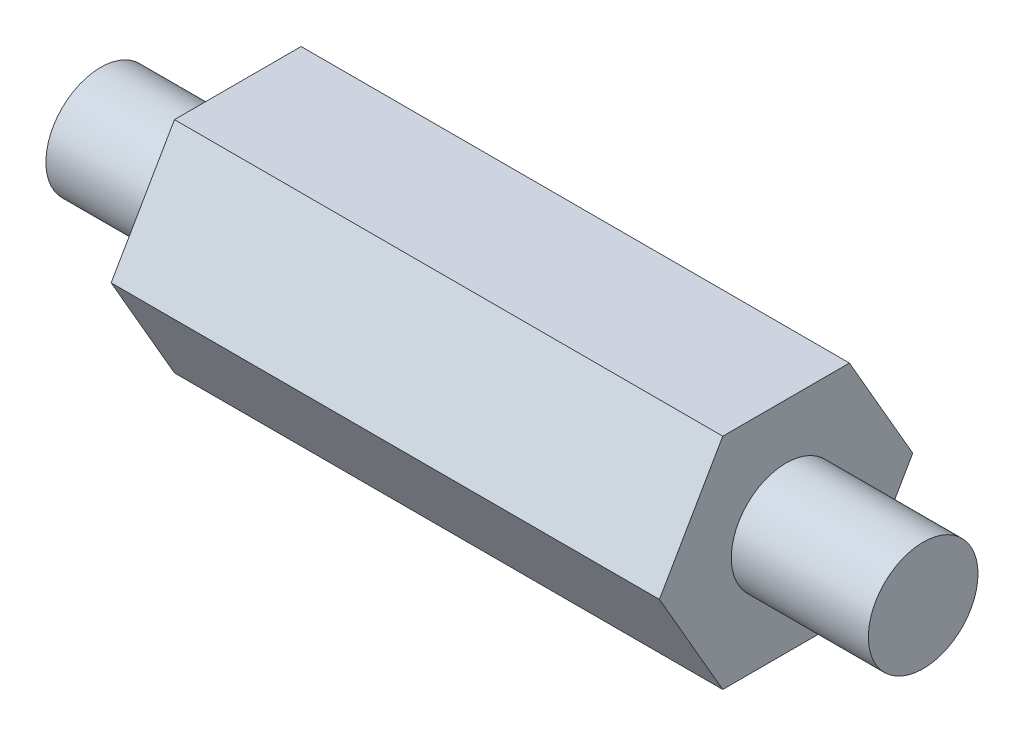
ISO-10303-21;
HEADER;
FILE_DESCRIPTION(('STEP AP214'),'2;1');
FILE_NAME('part.step','',(''),(''),'','','');
FILE_SCHEMA(('AUTOMOTIVE_DESIGN { 1 0 10303 214 1 1 1 1 }'));
ENDSEC;
DATA;
#1=APPLICATION_CONTEXT('core data for automotive mechanical design processes');
#2=APPLICATION_PROTOCOL_DEFINITION('international standard','automotive_design',2000,#1);
#3=PRODUCT_CONTEXT('',#1,'mechanical');
#4=PRODUCT('Part','Part','',(#3));
#5=PRODUCT_RELATED_PRODUCT_CATEGORY('part','',(#4));
#6=PRODUCT_DEFINITION_FORMATION('','',#4);
#7=PRODUCT_DEFINITION_CONTEXT('part definition',#1,'design');
#8=PRODUCT_DEFINITION('design','',#6,#7);
#9=PRODUCT_DEFINITION_SHAPE('','',#8);
#10=(LENGTH_UNIT() NAMED_UNIT(*) SI_UNIT(.MILLI.,.METRE.));
#11=(NAMED_UNIT(*) PLANE_ANGLE_UNIT() SI_UNIT($,.RADIAN.));
#12=(NAMED_UNIT(*) SI_UNIT($,.STERADIAN.) SOLID_ANGLE_UNIT());
#13=UNCERTAINTY_MEASURE_WITH_UNIT(LENGTH_MEASURE(1.E-05),#10,'distance_accuracy_value','');
#14=(GEOMETRIC_REPRESENTATION_CONTEXT(3) GLOBAL_UNCERTAINTY_ASSIGNED_CONTEXT((#13)) GLOBAL_UNIT_ASSIGNED_CONTEXT((#10,
#11,#12)) REPRESENTATION_CONTEXT('',''));
#15=CARTESIAN_POINT('',(0.,0.,0.));
#16=DIRECTION('',(0.,0.,1.));
#17=DIRECTION('',(1.,0.,0.));
#18=AXIS2_PLACEMENT_3D('',#15,#16,#17);
#19=CARTESIAN_POINT('',(15.,0.,0.));
#20=DIRECTION('',(-1.,0.,0.));
#21=DIRECTION('',(0.,0.,1.));
#22=AXIS2_PLACEMENT_3D('',#19,#20,#21);
#23=CYLINDRICAL_SURFACE('',#22,2.);
#24=CARTESIAN_POINT('',(10.,0.,0.));
#25=DIRECTION('',(1.,0.,0.));
#26=DIRECTION('',(0.,0.,-1.));
#27=AXIS2_PLACEMENT_3D('',#24,#25,#26);
#28=CIRCLE('',#27,2.);
#29=CARTESIAN_POINT('',(10.,0.,-2.));
#30=VERTEX_POINT('',#29);
#31=EDGE_CURVE('E115',#30,#30,#28,.T.);
#32=ORIENTED_EDGE('',*,*,#31,.T.);
#33=EDGE_LOOP('',(#32));
#34=FACE_BOUND('',#33,.T.);
#35=CARTESIAN_POINT('',(15.,0.,0.));
#36=DIRECTION('',(1.,0.,0.));
#37=DIRECTION('',(0.,0.,-1.));
#38=AXIS2_PLACEMENT_3D('',#35,#36,#37);
#39=CIRCLE('',#38,2.);
#40=CARTESIAN_POINT('',(15.,0.,-2.));
#41=VERTEX_POINT('',#40);
#42=EDGE_CURVE('E42',#41,#41,#39,.T.);
#43=ORIENTED_EDGE('',*,*,#42,.F.);
#44=EDGE_LOOP('',(#43));
#45=FACE_BOUND('',#44,.T.);
#46=ADVANCED_FACE('F34',(#34,#45),#23,.T.);
#47=CARTESIAN_POINT('',(15.,0.,0.));
#48=DIRECTION('',(1.,0.,0.));
#49=DIRECTION('',(0.,0.,-1.));
#50=AXIS2_PLACEMENT_3D('',#47,#48,#49);
#51=PLANE('',#50);
#52=ORIENTED_EDGE('',*,*,#42,.T.);
#53=EDGE_LOOP('',(#52));
#54=FACE_BOUND('',#53,.T.);
#55=ADVANCED_FACE('F161',(#54),#51,.T.);
#56=CARTESIAN_POINT('',(10.,2.00051868274205,3.465));
#57=DIRECTION('',(0.,0.5,0.866025403784439));
#58=DIRECTION('',(0.,-0.866025403784439,0.5));
#59=AXIS2_PLACEMENT_3D('',#56,#57,#58);
#60=PLANE('',#59);
#61=DIRECTION('',(0.,0.866025403784439,-0.5));
#62=VECTOR('',#61,1.);
#63=CARTESIAN_POINT('',(-10.,2.00051868274205,3.465));
#64=LINE('',#63,#62);
#65=CARTESIAN_POINT('',(-10.,0.,4.62));
#66=VERTEX_POINT('',#65);
#67=CARTESIAN_POINT('',(-10.,4.00103736548411,2.31));
#68=VERTEX_POINT('',#67);
#69=EDGE_CURVE('E121',#66,#68,#64,.T.);
#70=ORIENTED_EDGE('',*,*,#69,.F.);
#71=DIRECTION('',(-1.,0.,0.));
#72=VECTOR('',#71,1.);
#73=CARTESIAN_POINT('',(10.,0.,4.62));
#74=LINE('',#73,#72);
#75=CARTESIAN_POINT('',(10.,0.,4.62));
#76=VERTEX_POINT('',#75);
#77=EDGE_CURVE('E79',#76,#66,#74,.T.);
#78=ORIENTED_EDGE('',*,*,#77,.F.);
#79=DIRECTION('',(0.,0.866025403784439,-0.5));
#80=VECTOR('',#79,1.);
#81=CARTESIAN_POINT('',(10.,2.00051868274205,3.465));
#82=LINE('',#81,#80);
#83=CARTESIAN_POINT('',(10.,4.00103736548411,2.31));
#84=VERTEX_POINT('',#83);
#85=EDGE_CURVE('E135',#76,#84,#82,.T.);
#86=ORIENTED_EDGE('',*,*,#85,.T.);
#87=DIRECTION('',(-1.,0.,0.));
#88=VECTOR('',#87,1.);
#89=CARTESIAN_POINT('',(10.,4.00103736548411,2.31));
#90=LINE('',#89,#88);
#91=EDGE_CURVE('E50',#84,#68,#90,.T.);
#92=ORIENTED_EDGE('',*,*,#91,.T.);
#93=EDGE_LOOP('',(#70,#78,#86,#92));
#94=FACE_BOUND('',#93,.T.);
#95=ADVANCED_FACE('F166',(#94),#60,.T.);
#96=CARTESIAN_POINT('',(10.,-2.00051868274205,3.465));
#97=DIRECTION('',(0.,-0.5,0.866025403784439));
#98=DIRECTION('',(0.,-0.866025403784439,-0.5));
#99=AXIS2_PLACEMENT_3D('',#96,#97,#98);
#100=PLANE('',#99);
#101=DIRECTION('',(0.,0.866025403784439,0.5));
#102=VECTOR('',#101,1.);
#103=CARTESIAN_POINT('',(-10.,-2.00051868274205,3.465));
#104=LINE('',#103,#102);
#105=CARTESIAN_POINT('',(-10.,-4.00103736548411,2.31));
#106=VERTEX_POINT('',#105);
#107=EDGE_CURVE('E123',#106,#66,#104,.T.);
#108=ORIENTED_EDGE('',*,*,#107,.F.);
#109=DIRECTION('',(-1.,0.,0.));
#110=VECTOR('',#109,1.);
#111=CARTESIAN_POINT('',(10.,-4.00103736548411,2.31));
#112=LINE('',#111,#110);
#113=CARTESIAN_POINT('',(10.,-4.00103736548411,2.31));
#114=VERTEX_POINT('',#113);
#115=EDGE_CURVE('E139',#114,#106,#112,.T.);
#116=ORIENTED_EDGE('',*,*,#115,.F.);
#117=DIRECTION('',(0.,0.866025403784439,0.5));
#118=VECTOR('',#117,1.);
#119=CARTESIAN_POINT('',(10.,-2.00051868274205,3.465));
#120=LINE('',#119,#118);
#121=EDGE_CURVE('E198',#114,#76,#120,.T.);
#122=ORIENTED_EDGE('',*,*,#121,.T.);
#123=ORIENTED_EDGE('',*,*,#77,.T.);
#124=EDGE_LOOP('',(#108,#116,#122,#123));
#125=FACE_BOUND('',#124,.T.);
#126=ADVANCED_FACE('F186',(#125),#100,.T.);
#127=CARTESIAN_POINT('',(10.,-4.00103736548411,0.));
#128=DIRECTION('',(0.,-1.,0.));
#129=DIRECTION('',(0.,0.,-1.));
#130=AXIS2_PLACEMENT_3D('',#127,#128,#129);
#131=PLANE('',#130);
#132=DIRECTION('',(0.,0.,1.));
#133=VECTOR('',#132,1.);
#134=CARTESIAN_POINT('',(-10.,-4.00103736548411,0.));
#135=LINE('',#134,#133);
#136=CARTESIAN_POINT('',(-10.,-4.00103736548411,-2.31));
#137=VERTEX_POINT('',#136);
#138=EDGE_CURVE('E126',#137,#106,#135,.T.);
#139=ORIENTED_EDGE('',*,*,#138,.F.);
#140=DIRECTION('',(-1.,0.,0.));
#141=VECTOR('',#140,1.);
#142=CARTESIAN_POINT('',(10.,-4.00103736548411,-2.31));
#143=LINE('',#142,#141);
#144=CARTESIAN_POINT('',(10.,-4.00103736548411,-2.31));
#145=VERTEX_POINT('',#144);
#146=EDGE_CURVE('E99',#145,#137,#143,.T.);
#147=ORIENTED_EDGE('',*,*,#146,.F.);
#148=DIRECTION('',(0.,0.,1.));
#149=VECTOR('',#148,1.);
#150=CARTESIAN_POINT('',(10.,-4.00103736548411,0.));
#151=LINE('',#150,#149);
#152=EDGE_CURVE('E110',#145,#114,#151,.T.);
#153=ORIENTED_EDGE('',*,*,#152,.T.);
#154=ORIENTED_EDGE('',*,*,#115,.T.);
#155=EDGE_LOOP('',(#139,#147,#153,#154));
#156=FACE_BOUND('',#155,.T.);
#157=ADVANCED_FACE('F183',(#156),#131,.T.);
#158=CARTESIAN_POINT('',(10.,-2.00051868274205,-3.465));
#159=DIRECTION('',(0.,-0.5,-0.866025403784439));
#160=DIRECTION('',(0.,0.866025403784439,-0.5));
#161=AXIS2_PLACEMENT_3D('',#158,#159,#160);
#162=PLANE('',#161);
#163=DIRECTION('',(0.,-0.866025403784439,0.5));
#164=VECTOR('',#163,1.);
#165=CARTESIAN_POINT('',(-10.,-2.00051868274205,-3.465));
#166=LINE('',#165,#164);
#167=CARTESIAN_POINT('',(-10.,0.,-4.62));
#168=VERTEX_POINT('',#167);
#169=EDGE_CURVE('E95',#168,#137,#166,.T.);
#170=ORIENTED_EDGE('',*,*,#169,.F.);
#171=DIRECTION('',(-1.,0.,0.));
#172=VECTOR('',#171,1.);
#173=CARTESIAN_POINT('',(10.,0.,-4.62));
#174=LINE('',#173,#172);
#175=CARTESIAN_POINT('',(10.,0.,-4.62));
#176=VERTEX_POINT('',#175);
#177=EDGE_CURVE('E90',#176,#168,#174,.T.);
#178=ORIENTED_EDGE('',*,*,#177,.F.);
#179=DIRECTION('',(0.,-0.866025403784439,0.5));
#180=VECTOR('',#179,1.);
#181=CARTESIAN_POINT('',(10.,-2.00051868274205,-3.465));
#182=LINE('',#181,#180);
#183=EDGE_CURVE('E93',#176,#145,#182,.T.);
#184=ORIENTED_EDGE('',*,*,#183,.T.);
#185=ORIENTED_EDGE('',*,*,#146,.T.);
#186=EDGE_LOOP('',(#170,#178,#184,#185));
#187=FACE_BOUND('',#186,.T.);
#188=ADVANCED_FACE('F92',(#187),#162,.T.);
#189=CARTESIAN_POINT('',(10.,2.00051868274205,-3.465));
#190=DIRECTION('',(0.,0.5,-0.866025403784439));
#191=DIRECTION('',(0.,0.866025403784439,0.5));
#192=AXIS2_PLACEMENT_3D('',#189,#190,#191);
#193=PLANE('',#192);
#194=DIRECTION('',(0.,-0.866025403784439,-0.5));
#195=VECTOR('',#194,1.);
#196=CARTESIAN_POINT('',(-10.,2.00051868274205,-3.465));
#197=LINE('',#196,#195);
#198=CARTESIAN_POINT('',(-10.,4.00103736548411,-2.31));
#199=VERTEX_POINT('',#198);
#200=EDGE_CURVE('E130',#199,#168,#197,.T.);
#201=ORIENTED_EDGE('',*,*,#200,.F.);
#202=DIRECTION('',(-1.,0.,0.));
#203=VECTOR('',#202,1.);
#204=CARTESIAN_POINT('',(10.,4.00103736548411,-2.31));
#205=LINE('',#204,#203);
#206=CARTESIAN_POINT('',(10.,4.00103736548411,-2.31));
#207=VERTEX_POINT('',#206);
#208=EDGE_CURVE('E70',#207,#199,#205,.T.);
#209=ORIENTED_EDGE('',*,*,#208,.F.);
#210=DIRECTION('',(0.,-0.866025403784439,-0.5));
#211=VECTOR('',#210,1.);
#212=CARTESIAN_POINT('',(10.,2.00051868274205,-3.465));
#213=LINE('',#212,#211);
#214=EDGE_CURVE('E107',#207,#176,#213,.T.);
#215=ORIENTED_EDGE('',*,*,#214,.T.);
#216=ORIENTED_EDGE('',*,*,#177,.T.);
#217=EDGE_LOOP('',(#201,#209,#215,#216));
#218=FACE_BOUND('',#217,.T.);
#219=ADVANCED_FACE('F112',(#218),#193,.T.);
#220=CARTESIAN_POINT('',(10.,4.00103736548411,0.));
#221=DIRECTION('',(0.,1.,0.));
#222=DIRECTION('',(0.,0.,1.));
#223=AXIS2_PLACEMENT_3D('',#220,#221,#222);
#224=PLANE('',#223);
#225=DIRECTION('',(0.,0.,-1.));
#226=VECTOR('',#225,1.);
#227=CARTESIAN_POINT('',(-10.,4.00103736548411,0.));
#228=LINE('',#227,#226);
#229=EDGE_CURVE('E132',#68,#199,#228,.T.);
#230=ORIENTED_EDGE('',*,*,#229,.F.);
#231=ORIENTED_EDGE('',*,*,#91,.F.);
#232=DIRECTION('',(0.,0.,-1.));
#233=VECTOR('',#232,1.);
#234=CARTESIAN_POINT('',(10.,4.00103736548411,0.));
#235=LINE('',#234,#233);
#236=EDGE_CURVE('E113',#84,#207,#235,.T.);
#237=ORIENTED_EDGE('',*,*,#236,.T.);
#238=ORIENTED_EDGE('',*,*,#208,.T.);
#239=EDGE_LOOP('',(#230,#231,#237,#238));
#240=FACE_BOUND('',#239,.T.);
#241=ADVANCED_FACE('F172',(#240),#224,.T.);
#242=CARTESIAN_POINT('',(10.,0.,0.));
#243=DIRECTION('',(1.,0.,0.));
#244=DIRECTION('',(0.,0.,-1.));
#245=AXIS2_PLACEMENT_3D('',#242,#243,#244);
#246=PLANE('',#245);
#247=ORIENTED_EDGE('',*,*,#85,.F.);
#248=ORIENTED_EDGE('',*,*,#121,.F.);
#249=ORIENTED_EDGE('',*,*,#152,.F.);
#250=ORIENTED_EDGE('',*,*,#183,.F.);
#251=ORIENTED_EDGE('',*,*,#214,.F.);
#252=ORIENTED_EDGE('',*,*,#236,.F.);
#253=EDGE_LOOP('',(#247,#248,#249,#250,#251,#252));
#254=FACE_BOUND('',#253,.T.);
#255=ORIENTED_EDGE('',*,*,#31,.F.);
#256=EDGE_LOOP('',(#255));
#257=FACE_BOUND('',#256,.T.);
#258=ADVANCED_FACE('F104',(#254,#257),#246,.T.);
#259=CARTESIAN_POINT('',(-10.,0.,0.));
#260=DIRECTION('',(1.,0.,0.));
#261=DIRECTION('',(0.,0.,-1.));
#262=AXIS2_PLACEMENT_3D('',#259,#260,#261);
#263=PLANE('',#262);
#264=ORIENTED_EDGE('',*,*,#69,.T.);
#265=ORIENTED_EDGE('',*,*,#229,.T.);
#266=ORIENTED_EDGE('',*,*,#200,.T.);
#267=ORIENTED_EDGE('',*,*,#169,.T.);
#268=ORIENTED_EDGE('',*,*,#138,.T.);
#269=ORIENTED_EDGE('',*,*,#107,.T.);
#270=EDGE_LOOP('',(#264,#265,#266,#267,#268,#269));
#271=FACE_BOUND('',#270,.T.);
#272=CARTESIAN_POINT('',(-10.,0.,0.));
#273=DIRECTION('',(1.,0.,0.));
#274=DIRECTION('',(0.,0.,-1.));
#275=AXIS2_PLACEMENT_3D('',#272,#273,#274);
#276=CIRCLE('',#275,2.);
#277=CARTESIAN_POINT('',(-10.,0.,-2.));
#278=VERTEX_POINT('',#277);
#279=EDGE_CURVE('E11',#278,#278,#276,.T.);
#280=ORIENTED_EDGE('',*,*,#279,.T.);
#281=EDGE_LOOP('',(#280));
#282=FACE_BOUND('',#281,.T.);
#283=ADVANCED_FACE('F152',(#271,#282),#263,.F.);
#284=CARTESIAN_POINT('',(-15.,0.,0.));
#285=DIRECTION('',(1.,0.,0.));
#286=DIRECTION('',(0.,0.,-1.));
#287=AXIS2_PLACEMENT_3D('',#284,#285,#286);
#288=PLANE('',#287);
#289=CARTESIAN_POINT('',(-15.,0.,0.));
#290=DIRECTION('',(1.,0.,0.));
#291=DIRECTION('',(0.,0.,-1.));
#292=AXIS2_PLACEMENT_3D('',#289,#290,#291);
#293=CIRCLE('',#292,2.);
#294=CARTESIAN_POINT('',(-15.,0.,-2.));
#295=VERTEX_POINT('',#294);
#296=EDGE_CURVE('E142',#295,#295,#293,.T.);
#297=ORIENTED_EDGE('',*,*,#296,.F.);
#298=EDGE_LOOP('',(#297));
#299=FACE_BOUND('',#298,.T.);
#300=ADVANCED_FACE('F150',(#299),#288,.F.);
#301=ORIENTED_EDGE('',*,*,#296,.T.);
#302=EDGE_LOOP('',(#301));
#303=FACE_BOUND('',#302,.T.);
#304=ORIENTED_EDGE('',*,*,#279,.F.);
#305=EDGE_LOOP('',(#304));
#306=FACE_BOUND('',#305,.T.);
#307=ADVANCED_FACE('F147',(#303,#306),#23,.T.);
#308=CLOSED_SHELL('',(#46,#55,#95,#126,#157,#188,#219,#241,#258,#283,#300,#307));
#309=MANIFOLD_SOLID_BREP('B2',#308);
#310=ADVANCED_BREP_SHAPE_REPRESENTATION('',(#18,#309),#14);
#311=SHAPE_DEFINITION_REPRESENTATION(#9,#310);
ENDSEC;
END-ISO-10303-21;
